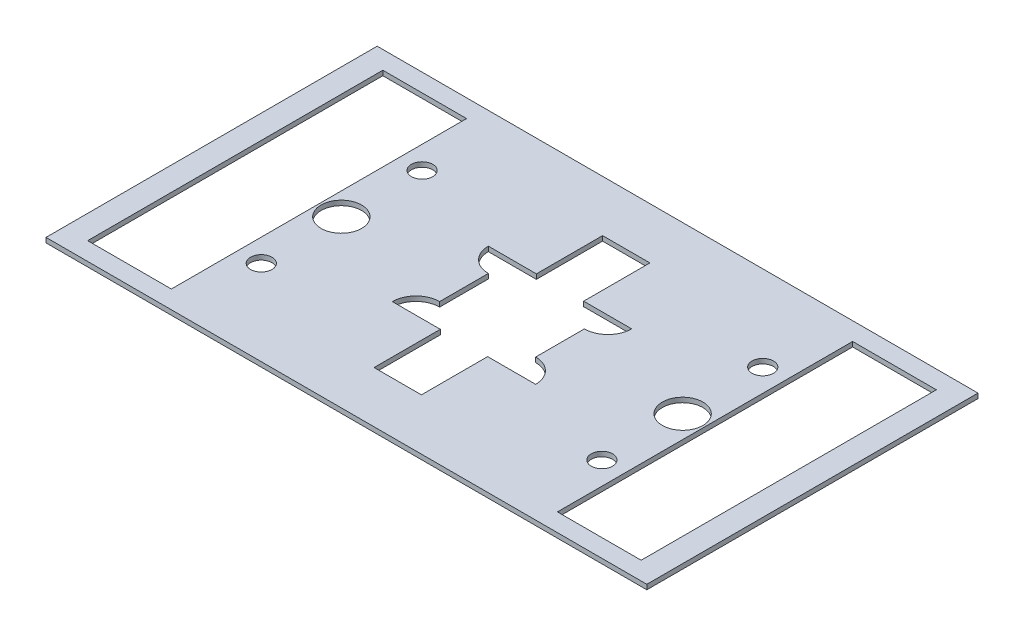
ISO-10303-21;
HEADER;
FILE_DESCRIPTION(('STEP AP214'),'2;1');
FILE_NAME('part.step','',(''),(''),'','','');
FILE_SCHEMA(('AUTOMOTIVE_DESIGN { 1 0 10303 214 1 1 1 1 }'));
ENDSEC;
DATA;
#1=APPLICATION_CONTEXT('core data for automotive mechanical design processes');
#2=APPLICATION_PROTOCOL_DEFINITION('international standard','automotive_design',2000,#1);
#3=PRODUCT_CONTEXT('',#1,'mechanical');
#4=PRODUCT('Part','Part','',(#3));
#5=PRODUCT_RELATED_PRODUCT_CATEGORY('part','',(#4));
#6=PRODUCT_DEFINITION_FORMATION('','',#4);
#7=PRODUCT_DEFINITION_CONTEXT('part definition',#1,'design');
#8=PRODUCT_DEFINITION('design','',#6,#7);
#9=PRODUCT_DEFINITION_SHAPE('','',#8);
#10=(LENGTH_UNIT() NAMED_UNIT(*) SI_UNIT(.MILLI.,.METRE.));
#11=(NAMED_UNIT(*) PLANE_ANGLE_UNIT() SI_UNIT($,.RADIAN.));
#12=(NAMED_UNIT(*) SI_UNIT($,.STERADIAN.) SOLID_ANGLE_UNIT());
#13=UNCERTAINTY_MEASURE_WITH_UNIT(LENGTH_MEASURE(1.E-05),#10,'distance_accuracy_value','');
#14=(GEOMETRIC_REPRESENTATION_CONTEXT(3) GLOBAL_UNCERTAINTY_ASSIGNED_CONTEXT((#13)) GLOBAL_UNIT_ASSIGNED_CONTEXT((#10,
#11,#12)) REPRESENTATION_CONTEXT('',''));
#15=CARTESIAN_POINT('',(0.,0.,0.));
#16=DIRECTION('',(0.,0.,1.));
#17=DIRECTION('',(1.,0.,0.));
#18=AXIS2_PLACEMENT_3D('',#15,#16,#17);
#19=CARTESIAN_POINT('',(0.,0.508,-15.6));
#20=DIRECTION('',(0.,0.,-1.));
#21=DIRECTION('',(-1.,0.,0.));
#22=AXIS2_PLACEMENT_3D('',#19,#20,#21);
#23=PLANE('',#22);
#24=DIRECTION('',(1.,0.,0.));
#25=VECTOR('',#24,1.);
#26=CARTESIAN_POINT('',(0.,0.,-15.6));
#27=LINE('',#26,#25);
#28=CARTESIAN_POINT('',(20.4,0.,-15.6));
#29=VERTEX_POINT('',#28);
#30=CARTESIAN_POINT('',(29.25,0.,-15.6));
#31=VERTEX_POINT('',#30);
#32=EDGE_CURVE('E339',#29,#31,#27,.T.);
#33=ORIENTED_EDGE('',*,*,#32,.T.);
#34=DIRECTION('',(0.,-1.,0.));
#35=VECTOR('',#34,1.);
#36=CARTESIAN_POINT('',(29.25,0.508,-15.6));
#37=LINE('',#36,#35);
#38=CARTESIAN_POINT('',(29.25,0.508,-15.6));
#39=VERTEX_POINT('',#38);
#40=EDGE_CURVE('E11',#39,#31,#37,.T.);
#41=ORIENTED_EDGE('',*,*,#40,.F.);
#42=DIRECTION('',(1.,0.,0.));
#43=VECTOR('',#42,1.);
#44=CARTESIAN_POINT('',(0.,0.508,-15.6));
#45=LINE('',#44,#43);
#46=CARTESIAN_POINT('',(20.4,0.508,-15.6));
#47=VERTEX_POINT('',#46);
#48=EDGE_CURVE('E236',#47,#39,#45,.T.);
#49=ORIENTED_EDGE('',*,*,#48,.F.);
#50=DIRECTION('',(0.,-1.,0.));
#51=VECTOR('',#50,1.);
#52=CARTESIAN_POINT('',(20.4,0.508,-15.6));
#53=LINE('',#52,#51);
#54=EDGE_CURVE('E56',#47,#29,#53,.T.);
#55=ORIENTED_EDGE('',*,*,#54,.T.);
#56=EDGE_LOOP('',(#33,#41,#49,#55));
#57=FACE_BOUND('',#56,.T.);
#58=ADVANCED_FACE('F37',(#57),#23,.F.);
#59=CARTESIAN_POINT('',(29.25,0.508,0.));
#60=DIRECTION('',(1.,0.,0.));
#61=DIRECTION('',(0.,0.,-1.));
#62=AXIS2_PLACEMENT_3D('',#59,#60,#61);
#63=PLANE('',#62);
#64=DIRECTION('',(0.,0.,1.));
#65=VECTOR('',#64,1.);
#66=CARTESIAN_POINT('',(29.25,0.,0.));
#67=LINE('',#66,#65);
#68=CARTESIAN_POINT('',(29.25,0.,15.6));
#69=VERTEX_POINT('',#68);
#70=EDGE_CURVE('E242',#31,#69,#67,.T.);
#71=ORIENTED_EDGE('',*,*,#70,.T.);
#72=DIRECTION('',(0.,-1.,0.));
#73=VECTOR('',#72,1.);
#74=CARTESIAN_POINT('',(29.25,0.508,15.6));
#75=LINE('',#74,#73);
#76=CARTESIAN_POINT('',(29.25,0.508,15.6));
#77=VERTEX_POINT('',#76);
#78=EDGE_CURVE('E47',#77,#69,#75,.T.);
#79=ORIENTED_EDGE('',*,*,#78,.F.);
#80=DIRECTION('',(0.,0.,1.));
#81=VECTOR('',#80,1.);
#82=CARTESIAN_POINT('',(29.25,0.508,0.));
#83=LINE('',#82,#81);
#84=EDGE_CURVE('E230',#39,#77,#83,.T.);
#85=ORIENTED_EDGE('',*,*,#84,.F.);
#86=ORIENTED_EDGE('',*,*,#40,.T.);
#87=EDGE_LOOP('',(#71,#79,#85,#86));
#88=FACE_BOUND('',#87,.T.);
#89=ADVANCED_FACE('F241',(#88),#63,.F.);
#90=CARTESIAN_POINT('',(0.,0.508,15.6));
#91=DIRECTION('',(0.,0.,-1.));
#92=DIRECTION('',(-1.,0.,0.));
#93=AXIS2_PLACEMENT_3D('',#90,#91,#92);
#94=PLANE('',#93);
#95=DIRECTION('',(1.,0.,0.));
#96=VECTOR('',#95,1.);
#97=CARTESIAN_POINT('',(0.,0.,15.6));
#98=LINE('',#97,#96);
#99=CARTESIAN_POINT('',(20.4,0.,15.6));
#100=VERTEX_POINT('',#99);
#101=EDGE_CURVE('E342',#100,#69,#98,.T.);
#102=ORIENTED_EDGE('',*,*,#101,.F.);
#103=DIRECTION('',(0.,-1.,0.));
#104=VECTOR('',#103,1.);
#105=CARTESIAN_POINT('',(20.4,0.508,15.6));
#106=LINE('',#105,#104);
#107=CARTESIAN_POINT('',(20.4,0.508,15.6));
#108=VERTEX_POINT('',#107);
#109=EDGE_CURVE('E142',#108,#100,#106,.T.);
#110=ORIENTED_EDGE('',*,*,#109,.F.);
#111=DIRECTION('',(1.,0.,0.));
#112=VECTOR('',#111,1.);
#113=CARTESIAN_POINT('',(0.,0.508,15.6));
#114=LINE('',#113,#112);
#115=EDGE_CURVE('E235',#108,#77,#114,.T.);
#116=ORIENTED_EDGE('',*,*,#115,.T.);
#117=ORIENTED_EDGE('',*,*,#78,.T.);
#118=EDGE_LOOP('',(#102,#110,#116,#117));
#119=FACE_BOUND('',#118,.T.);
#120=ADVANCED_FACE('F246',(#119),#94,.T.);
#121=CARTESIAN_POINT('',(0.,0.508,-15.6));
#122=DIRECTION('',(0.,0.,-1.));
#123=DIRECTION('',(-1.,0.,0.));
#124=AXIS2_PLACEMENT_3D('',#121,#122,#123);
#125=PLANE('',#124);
#126=DIRECTION('',(1.,0.,0.));
#127=VECTOR('',#126,1.);
#128=CARTESIAN_POINT('',(0.,0.,-15.6));
#129=LINE('',#128,#127);
#130=CARTESIAN_POINT('',(-29.25,0.,-15.6));
#131=VERTEX_POINT('',#130);
#132=CARTESIAN_POINT('',(-20.4,0.,-15.6));
#133=VERTEX_POINT('',#132);
#134=EDGE_CURVE('E327',#131,#133,#129,.T.);
#135=ORIENTED_EDGE('',*,*,#134,.T.);
#136=DIRECTION('',(0.,-1.,0.));
#137=VECTOR('',#136,1.);
#138=CARTESIAN_POINT('',(-20.4,0.508,-15.6));
#139=LINE('',#138,#137);
#140=CARTESIAN_POINT('',(-20.4,0.508,-15.6));
#141=VERTEX_POINT('',#140);
#142=EDGE_CURVE('E349',#141,#133,#139,.T.);
#143=ORIENTED_EDGE('',*,*,#142,.F.);
#144=DIRECTION('',(1.,0.,0.));
#145=VECTOR('',#144,1.);
#146=CARTESIAN_POINT('',(0.,0.508,-15.6));
#147=LINE('',#146,#145);
#148=CARTESIAN_POINT('',(-29.25,0.508,-15.6));
#149=VERTEX_POINT('',#148);
#150=EDGE_CURVE('E488',#149,#141,#147,.T.);
#151=ORIENTED_EDGE('',*,*,#150,.F.);
#152=DIRECTION('',(0.,-1.,0.));
#153=VECTOR('',#152,1.);
#154=CARTESIAN_POINT('',(-29.25,0.508,-15.6));
#155=LINE('',#154,#153);
#156=EDGE_CURVE('E351',#149,#131,#155,.T.);
#157=ORIENTED_EDGE('',*,*,#156,.T.);
#158=EDGE_LOOP('',(#135,#143,#151,#157));
#159=FACE_BOUND('',#158,.T.);
#160=ADVANCED_FACE('F514',(#159),#125,.F.);
#161=CARTESIAN_POINT('',(-20.4,0.508,0.));
#162=DIRECTION('',(1.,0.,0.));
#163=DIRECTION('',(0.,0.,-1.));
#164=AXIS2_PLACEMENT_3D('',#161,#162,#163);
#165=PLANE('',#164);
#166=DIRECTION('',(0.,0.,1.));
#167=VECTOR('',#166,1.);
#168=CARTESIAN_POINT('',(-20.4,0.,0.));
#169=LINE('',#168,#167);
#170=CARTESIAN_POINT('',(-20.4,0.,15.6));
#171=VERTEX_POINT('',#170);
#172=EDGE_CURVE('E330',#133,#171,#169,.T.);
#173=ORIENTED_EDGE('',*,*,#172,.T.);
#174=DIRECTION('',(0.,-1.,0.));
#175=VECTOR('',#174,1.);
#176=CARTESIAN_POINT('',(-20.4,0.508,15.6));
#177=LINE('',#176,#175);
#178=CARTESIAN_POINT('',(-20.4,0.508,15.6));
#179=VERTEX_POINT('',#178);
#180=EDGE_CURVE('E356',#179,#171,#177,.T.);
#181=ORIENTED_EDGE('',*,*,#180,.F.);
#182=DIRECTION('',(0.,0.,1.));
#183=VECTOR('',#182,1.);
#184=CARTESIAN_POINT('',(-20.4,0.508,0.));
#185=LINE('',#184,#183);
#186=EDGE_CURVE('E491',#141,#179,#185,.T.);
#187=ORIENTED_EDGE('',*,*,#186,.F.);
#188=ORIENTED_EDGE('',*,*,#142,.T.);
#189=EDGE_LOOP('',(#173,#181,#187,#188));
#190=FACE_BOUND('',#189,.T.);
#191=ADVANCED_FACE('F516',(#190),#165,.F.);
#192=CARTESIAN_POINT('',(0.,0.508,15.6));
#193=DIRECTION('',(0.,0.,-1.));
#194=DIRECTION('',(-1.,0.,0.));
#195=AXIS2_PLACEMENT_3D('',#192,#193,#194);
#196=PLANE('',#195);
#197=DIRECTION('',(1.,0.,0.));
#198=VECTOR('',#197,1.);
#199=CARTESIAN_POINT('',(0.,0.,15.6));
#200=LINE('',#199,#198);
#201=CARTESIAN_POINT('',(-29.25,0.,15.6));
#202=VERTEX_POINT('',#201);
#203=EDGE_CURVE('E333',#202,#171,#200,.T.);
#204=ORIENTED_EDGE('',*,*,#203,.F.);
#205=DIRECTION('',(0.,-1.,0.));
#206=VECTOR('',#205,1.);
#207=CARTESIAN_POINT('',(-29.25,0.508,15.6));
#208=LINE('',#207,#206);
#209=CARTESIAN_POINT('',(-29.25,0.508,15.6));
#210=VERTEX_POINT('',#209);
#211=EDGE_CURVE('E353',#210,#202,#208,.T.);
#212=ORIENTED_EDGE('',*,*,#211,.F.);
#213=DIRECTION('',(1.,0.,0.));
#214=VECTOR('',#213,1.);
#215=CARTESIAN_POINT('',(0.,0.508,15.6));
#216=LINE('',#215,#214);
#217=EDGE_CURVE('E493',#210,#179,#216,.T.);
#218=ORIENTED_EDGE('',*,*,#217,.T.);
#219=ORIENTED_EDGE('',*,*,#180,.T.);
#220=EDGE_LOOP('',(#204,#212,#218,#219));
#221=FACE_BOUND('',#220,.T.);
#222=ADVANCED_FACE('F509',(#221),#196,.T.);
#223=CARTESIAN_POINT('',(31.75,0.508,0.));
#224=DIRECTION('',(1.,0.,0.));
#225=DIRECTION('',(0.,0.,-1.));
#226=AXIS2_PLACEMENT_3D('',#223,#224,#225);
#227=PLANE('',#226);
#228=DIRECTION('',(0.,0.,1.));
#229=VECTOR('',#228,1.);
#230=CARTESIAN_POINT('',(31.75,0.,0.));
#231=LINE('',#230,#229);
#232=CARTESIAN_POINT('',(31.75,0.,-17.5));
#233=VERTEX_POINT('',#232);
#234=CARTESIAN_POINT('',(31.75,0.,17.5));
#235=VERTEX_POINT('',#234);
#236=EDGE_CURVE('E315',#233,#235,#231,.T.);
#237=ORIENTED_EDGE('',*,*,#236,.F.);
#238=DIRECTION('',(0.,-1.,0.));
#239=VECTOR('',#238,1.);
#240=CARTESIAN_POINT('',(31.75,0.508,-17.5));
#241=LINE('',#240,#239);
#242=CARTESIAN_POINT('',(31.75,0.508,-17.5));
#243=VERTEX_POINT('',#242);
#244=EDGE_CURVE('E354',#243,#233,#241,.T.);
#245=ORIENTED_EDGE('',*,*,#244,.F.);
#246=DIRECTION('',(0.,0.,1.));
#247=VECTOR('',#246,1.);
#248=CARTESIAN_POINT('',(31.75,0.508,0.));
#249=LINE('',#248,#247);
#250=CARTESIAN_POINT('',(31.75,0.508,17.5));
#251=VERTEX_POINT('',#250);
#252=EDGE_CURVE('E477',#243,#251,#249,.T.);
#253=ORIENTED_EDGE('',*,*,#252,.T.);
#254=DIRECTION('',(0.,-1.,0.));
#255=VECTOR('',#254,1.);
#256=CARTESIAN_POINT('',(31.75,0.508,17.5));
#257=LINE('',#256,#255);
#258=EDGE_CURVE('E360',#251,#235,#257,.T.);
#259=ORIENTED_EDGE('',*,*,#258,.T.);
#260=EDGE_LOOP('',(#237,#245,#253,#259));
#261=FACE_BOUND('',#260,.T.);
#262=ADVANCED_FACE('F523',(#261),#227,.T.);
#263=CARTESIAN_POINT('',(0.,0.508,-17.5));
#264=DIRECTION('',(0.,0.,-1.));
#265=DIRECTION('',(-1.,0.,0.));
#266=AXIS2_PLACEMENT_3D('',#263,#264,#265);
#267=PLANE('',#266);
#268=DIRECTION('',(1.,0.,0.));
#269=VECTOR('',#268,1.);
#270=CARTESIAN_POINT('',(0.,0.,-17.5));
#271=LINE('',#270,#269);
#272=CARTESIAN_POINT('',(-31.75,0.,-17.5));
#273=VERTEX_POINT('',#272);
#274=EDGE_CURVE('E318',#273,#233,#271,.T.);
#275=ORIENTED_EDGE('',*,*,#274,.F.);
#276=DIRECTION('',(0.,-1.,0.));
#277=VECTOR('',#276,1.);
#278=CARTESIAN_POINT('',(-31.75,0.508,-17.5));
#279=LINE('',#278,#277);
#280=CARTESIAN_POINT('',(-31.75,0.508,-17.5));
#281=VERTEX_POINT('',#280);
#282=EDGE_CURVE('E365',#281,#273,#279,.T.);
#283=ORIENTED_EDGE('',*,*,#282,.F.);
#284=DIRECTION('',(1.,0.,0.));
#285=VECTOR('',#284,1.);
#286=CARTESIAN_POINT('',(0.,0.508,-17.5));
#287=LINE('',#286,#285);
#288=EDGE_CURVE('E480',#281,#243,#287,.T.);
#289=ORIENTED_EDGE('',*,*,#288,.T.);
#290=ORIENTED_EDGE('',*,*,#244,.T.);
#291=EDGE_LOOP('',(#275,#283,#289,#290));
#292=FACE_BOUND('',#291,.T.);
#293=ADVANCED_FACE('F604',(#292),#267,.T.);
#294=CARTESIAN_POINT('',(-31.75,0.508,0.));
#295=DIRECTION('',(1.,0.,0.));
#296=DIRECTION('',(0.,0.,-1.));
#297=AXIS2_PLACEMENT_3D('',#294,#295,#296);
#298=PLANE('',#297);
#299=DIRECTION('',(0.,0.,1.));
#300=VECTOR('',#299,1.);
#301=CARTESIAN_POINT('',(-31.75,0.,0.));
#302=LINE('',#301,#300);
#303=CARTESIAN_POINT('',(-31.75,0.,17.5));
#304=VERTEX_POINT('',#303);
#305=EDGE_CURVE('E321',#273,#304,#302,.T.);
#306=ORIENTED_EDGE('',*,*,#305,.T.);
#307=DIRECTION('',(0.,-1.,0.));
#308=VECTOR('',#307,1.);
#309=CARTESIAN_POINT('',(-31.75,0.508,17.5));
#310=LINE('',#309,#308);
#311=CARTESIAN_POINT('',(-31.75,0.508,17.5));
#312=VERTEX_POINT('',#311);
#313=EDGE_CURVE('E362',#312,#304,#310,.T.);
#314=ORIENTED_EDGE('',*,*,#313,.F.);
#315=DIRECTION('',(0.,0.,1.));
#316=VECTOR('',#315,1.);
#317=CARTESIAN_POINT('',(-31.75,0.508,0.));
#318=LINE('',#317,#316);
#319=EDGE_CURVE('E483',#281,#312,#318,.T.);
#320=ORIENTED_EDGE('',*,*,#319,.F.);
#321=ORIENTED_EDGE('',*,*,#282,.T.);
#322=EDGE_LOOP('',(#306,#314,#320,#321));
#323=FACE_BOUND('',#322,.T.);
#324=ADVANCED_FACE('F600',(#323),#298,.F.);
#325=CARTESIAN_POINT('',(0.,0.508,5.075));
#326=DIRECTION('',(0.,0.,-1.));
#327=DIRECTION('',(-1.,0.,0.));
#328=AXIS2_PLACEMENT_3D('',#325,#326,#327);
#329=PLANE('',#328);
#330=DIRECTION('',(1.,0.,0.));
#331=VECTOR('',#330,1.);
#332=CARTESIAN_POINT('',(0.,0.,5.075));
#333=LINE('',#332,#331);
#334=CARTESIAN_POINT('',(-7.575,0.,5.075));
#335=VERTEX_POINT('',#334);
#336=CARTESIAN_POINT('',(-2.5,0.,5.075));
#337=VERTEX_POINT('',#336);
#338=EDGE_CURVE('E253',#335,#337,#333,.T.);
#339=ORIENTED_EDGE('',*,*,#338,.F.);
#340=DIRECTION('',(0.,-1.,0.));
#341=VECTOR('',#340,1.);
#342=CARTESIAN_POINT('',(-7.575,0.508,5.075));
#343=LINE('',#342,#341);
#344=CARTESIAN_POINT('',(-7.575,0.508,5.075));
#345=VERTEX_POINT('',#344);
#346=EDGE_CURVE('E41',#345,#335,#343,.T.);
#347=ORIENTED_EDGE('',*,*,#346,.F.);
#348=DIRECTION('',(1.,0.,0.));
#349=VECTOR('',#348,1.);
#350=CARTESIAN_POINT('',(0.,0.508,5.075));
#351=LINE('',#350,#349);
#352=CARTESIAN_POINT('',(-2.5,0.508,5.075));
#353=VERTEX_POINT('',#352);
#354=EDGE_CURVE('E347',#345,#353,#351,.T.);
#355=ORIENTED_EDGE('',*,*,#354,.T.);
#356=DIRECTION('',(0.,-1.,0.));
#357=VECTOR('',#356,1.);
#358=CARTESIAN_POINT('',(-2.5,0.508,5.075));
#359=LINE('',#358,#357);
#360=EDGE_CURVE('E249',#353,#337,#359,.T.);
#361=ORIENTED_EDGE('',*,*,#360,.T.);
#362=EDGE_LOOP('',(#339,#347,#355,#361));
#363=FACE_BOUND('',#362,.T.);
#364=ADVANCED_FACE('F39',(#363),#329,.T.);
#365=CARTESIAN_POINT('',(-5.075,0.508,5.075));
#366=DIRECTION('',(0.,-1.,0.));
#367=DIRECTION('',(0.,0.,-1.));
#368=AXIS2_PLACEMENT_3D('',#365,#366,#367);
#369=CYLINDRICAL_SURFACE('',#368,2.5);
#370=CARTESIAN_POINT('',(-5.075,0.,5.075));
#371=DIRECTION('',(0.,1.,0.));
#372=DIRECTION('',(0.,0.,1.));
#373=AXIS2_PLACEMENT_3D('',#370,#371,#372);
#374=CIRCLE('',#373,2.5);
#375=CARTESIAN_POINT('',(-5.075,0.,2.575));
#376=VERTEX_POINT('',#375);
#377=EDGE_CURVE('E256',#376,#335,#374,.T.);
#378=ORIENTED_EDGE('',*,*,#377,.F.);
#379=DIRECTION('',(0.,-1.,0.));
#380=VECTOR('',#379,1.);
#381=CARTESIAN_POINT('',(-5.075,0.508,2.575));
#382=LINE('',#381,#380);
#383=CARTESIAN_POINT('',(-5.075,0.508,2.575));
#384=VERTEX_POINT('',#383);
#385=EDGE_CURVE('E398',#384,#376,#382,.T.);
#386=ORIENTED_EDGE('',*,*,#385,.F.);
#387=CARTESIAN_POINT('',(-5.075,0.508,5.075));
#388=DIRECTION('',(0.,1.,0.));
#389=DIRECTION('',(0.,0.,1.));
#390=AXIS2_PLACEMENT_3D('',#387,#388,#389);
#391=CIRCLE('',#390,2.5);
#392=EDGE_CURVE('E407',#384,#345,#391,.T.);
#393=ORIENTED_EDGE('',*,*,#392,.T.);
#394=ORIENTED_EDGE('',*,*,#346,.T.);
#395=EDGE_LOOP('',(#378,#386,#393,#394));
#396=FACE_BOUND('',#395,.T.);
#397=ADVANCED_FACE('F405',(#396),#369,.F.);
#398=CARTESIAN_POINT('',(-5.075,0.508,0.));
#399=DIRECTION('',(1.,0.,0.));
#400=DIRECTION('',(0.,0.,-1.));
#401=AXIS2_PLACEMENT_3D('',#398,#399,#400);
#402=PLANE('',#401);
#403=DIRECTION('',(0.,0.,1.));
#404=VECTOR('',#403,1.);
#405=CARTESIAN_POINT('',(-5.075,0.,0.));
#406=LINE('',#405,#404);
#407=CARTESIAN_POINT('',(-5.075,0.,-2.575));
#408=VERTEX_POINT('',#407);
#409=EDGE_CURVE('E259',#408,#376,#406,.T.);
#410=ORIENTED_EDGE('',*,*,#409,.F.);
#411=DIRECTION('',(0.,-1.,0.));
#412=VECTOR('',#411,1.);
#413=CARTESIAN_POINT('',(-5.075,0.508,-2.575));
#414=LINE('',#413,#412);
#415=CARTESIAN_POINT('',(-5.075,0.508,-2.575));
#416=VERTEX_POINT('',#415);
#417=EDGE_CURVE('E397',#416,#408,#414,.T.);
#418=ORIENTED_EDGE('',*,*,#417,.F.);
#419=DIRECTION('',(0.,0.,1.));
#420=VECTOR('',#419,1.);
#421=CARTESIAN_POINT('',(-5.075,0.508,0.));
#422=LINE('',#421,#420);
#423=EDGE_CURVE('E416',#416,#384,#422,.T.);
#424=ORIENTED_EDGE('',*,*,#423,.T.);
#425=ORIENTED_EDGE('',*,*,#385,.T.);
#426=EDGE_LOOP('',(#410,#418,#424,#425));
#427=FACE_BOUND('',#426,.T.);
#428=ADVANCED_FACE('F414',(#427),#402,.T.);
#429=CARTESIAN_POINT('',(-5.075,0.508,-5.075));
#430=DIRECTION('',(0.,-1.,0.));
#431=DIRECTION('',(0.,0.,-1.));
#432=AXIS2_PLACEMENT_3D('',#429,#430,#431);
#433=CYLINDRICAL_SURFACE('',#432,2.5);
#434=CARTESIAN_POINT('',(-5.075,0.,-5.075));
#435=DIRECTION('',(0.,1.,0.));
#436=DIRECTION('',(0.,0.,1.));
#437=AXIS2_PLACEMENT_3D('',#434,#435,#436);
#438=CIRCLE('',#437,2.5);
#439=CARTESIAN_POINT('',(-7.575,0.,-5.075));
#440=VERTEX_POINT('',#439);
#441=EDGE_CURVE('E262',#440,#408,#438,.T.);
#442=ORIENTED_EDGE('',*,*,#441,.F.);
#443=DIRECTION('',(0.,-1.,0.));
#444=VECTOR('',#443,1.);
#445=CARTESIAN_POINT('',(-7.575,0.508,-5.075));
#446=LINE('',#445,#444);
#447=CARTESIAN_POINT('',(-7.575,0.508,-5.075));
#448=VERTEX_POINT('',#447);
#449=EDGE_CURVE('E395',#448,#440,#446,.T.);
#450=ORIENTED_EDGE('',*,*,#449,.F.);
#451=CARTESIAN_POINT('',(-5.075,0.508,-5.075));
#452=DIRECTION('',(0.,1.,0.));
#453=DIRECTION('',(0.,0.,1.));
#454=AXIS2_PLACEMENT_3D('',#451,#452,#453);
#455=CIRCLE('',#454,2.5);
#456=EDGE_CURVE('E422',#448,#416,#455,.T.);
#457=ORIENTED_EDGE('',*,*,#456,.T.);
#458=ORIENTED_EDGE('',*,*,#417,.T.);
#459=EDGE_LOOP('',(#442,#450,#457,#458));
#460=FACE_BOUND('',#459,.T.);
#461=ADVANCED_FACE('F424',(#460),#433,.F.);
#462=CARTESIAN_POINT('',(0.,0.508,-5.075));
#463=DIRECTION('',(0.,0.,-1.));
#464=DIRECTION('',(-1.,0.,0.));
#465=AXIS2_PLACEMENT_3D('',#462,#463,#464);
#466=PLANE('',#465);
#467=DIRECTION('',(1.,0.,0.));
#468=VECTOR('',#467,1.);
#469=CARTESIAN_POINT('',(0.,0.,-5.075));
#470=LINE('',#469,#468);
#471=CARTESIAN_POINT('',(-2.5,0.,-5.075));
#472=VERTEX_POINT('',#471);
#473=EDGE_CURVE('E265',#440,#472,#470,.T.);
#474=ORIENTED_EDGE('',*,*,#473,.T.);
#475=DIRECTION('',(0.,-1.,0.));
#476=VECTOR('',#475,1.);
#477=CARTESIAN_POINT('',(-2.5,0.508,-5.075));
#478=LINE('',#477,#476);
#479=CARTESIAN_POINT('',(-2.5,0.508,-5.075));
#480=VERTEX_POINT('',#479);
#481=EDGE_CURVE('E392',#480,#472,#478,.T.);
#482=ORIENTED_EDGE('',*,*,#481,.F.);
#483=DIRECTION('',(1.,0.,0.));
#484=VECTOR('',#483,1.);
#485=CARTESIAN_POINT('',(0.,0.508,-5.075));
#486=LINE('',#485,#484);
#487=EDGE_CURVE('E426',#448,#480,#486,.T.);
#488=ORIENTED_EDGE('',*,*,#487,.F.);
#489=ORIENTED_EDGE('',*,*,#449,.T.);
#490=EDGE_LOOP('',(#474,#482,#488,#489));
#491=FACE_BOUND('',#490,.T.);
#492=ADVANCED_FACE('F588',(#491),#466,.F.);
#493=CARTESIAN_POINT('',(-2.5,0.508,0.));
#494=DIRECTION('',(-1.,0.,0.));
#495=DIRECTION('',(0.,0.,1.));
#496=AXIS2_PLACEMENT_3D('',#493,#494,#495);
#497=PLANE('',#496);
#498=DIRECTION('',(0.,0.,-1.));
#499=VECTOR('',#498,1.);
#500=CARTESIAN_POINT('',(-2.5,0.,0.));
#501=LINE('',#500,#499);
#502=CARTESIAN_POINT('',(-2.5,0.,-12.075));
#503=VERTEX_POINT('',#502);
#504=EDGE_CURVE('E267',#472,#503,#501,.T.);
#505=ORIENTED_EDGE('',*,*,#504,.T.);
#506=DIRECTION('',(0.,-1.,0.));
#507=VECTOR('',#506,1.);
#508=CARTESIAN_POINT('',(-2.5,0.508,-12.075));
#509=LINE('',#508,#507);
#510=CARTESIAN_POINT('',(-2.5,0.508,-12.075));
#511=VERTEX_POINT('',#510);
#512=EDGE_CURVE('E389',#511,#503,#509,.T.);
#513=ORIENTED_EDGE('',*,*,#512,.F.);
#514=DIRECTION('',(0.,0.,-1.));
#515=VECTOR('',#514,1.);
#516=CARTESIAN_POINT('',(-2.5,0.508,0.));
#517=LINE('',#516,#515);
#518=EDGE_CURVE('E428',#480,#511,#517,.T.);
#519=ORIENTED_EDGE('',*,*,#518,.F.);
#520=ORIENTED_EDGE('',*,*,#481,.T.);
#521=EDGE_LOOP('',(#505,#513,#519,#520));
#522=FACE_BOUND('',#521,.T.);
#523=ADVANCED_FACE('F584',(#522),#497,.F.);
#524=CARTESIAN_POINT('',(0.,0.508,-12.075));
#525=DIRECTION('',(0.,0.,-1.));
#526=DIRECTION('',(-1.,0.,0.));
#527=AXIS2_PLACEMENT_3D('',#524,#525,#526);
#528=PLANE('',#527);
#529=DIRECTION('',(1.,0.,0.));
#530=VECTOR('',#529,1.);
#531=CARTESIAN_POINT('',(0.,0.,-12.075));
#532=LINE('',#531,#530);
#533=CARTESIAN_POINT('',(2.5,0.,-12.075));
#534=VERTEX_POINT('',#533);
#535=EDGE_CURVE('E269',#503,#534,#532,.T.);
#536=ORIENTED_EDGE('',*,*,#535,.T.);
#537=DIRECTION('',(0.,-1.,0.));
#538=VECTOR('',#537,1.);
#539=CARTESIAN_POINT('',(2.5,0.508,-12.075));
#540=LINE('',#539,#538);
#541=CARTESIAN_POINT('',(2.5,0.508,-12.075));
#542=VERTEX_POINT('',#541);
#543=EDGE_CURVE('E386',#542,#534,#540,.T.);
#544=ORIENTED_EDGE('',*,*,#543,.F.);
#545=DIRECTION('',(1.,0.,0.));
#546=VECTOR('',#545,1.);
#547=CARTESIAN_POINT('',(0.,0.508,-12.075));
#548=LINE('',#547,#546);
#549=EDGE_CURVE('E433',#511,#542,#548,.T.);
#550=ORIENTED_EDGE('',*,*,#549,.F.);
#551=ORIENTED_EDGE('',*,*,#512,.T.);
#552=EDGE_LOOP('',(#536,#544,#550,#551));
#553=FACE_BOUND('',#552,.T.);
#554=ADVANCED_FACE('F580',(#553),#528,.F.);
#555=CARTESIAN_POINT('',(2.5,0.508,0.));
#556=DIRECTION('',(1.,0.,0.));
#557=DIRECTION('',(0.,0.,-1.));
#558=AXIS2_PLACEMENT_3D('',#555,#556,#557);
#559=PLANE('',#558);
#560=DIRECTION('',(0.,0.,1.));
#561=VECTOR('',#560,1.);
#562=CARTESIAN_POINT('',(2.5,0.,0.));
#563=LINE('',#562,#561);
#564=CARTESIAN_POINT('',(2.5,0.,-5.075));
#565=VERTEX_POINT('',#564);
#566=EDGE_CURVE('E271',#534,#565,#563,.T.);
#567=ORIENTED_EDGE('',*,*,#566,.T.);
#568=DIRECTION('',(0.,-1.,0.));
#569=VECTOR('',#568,1.);
#570=CARTESIAN_POINT('',(2.5,0.508,-5.075));
#571=LINE('',#570,#569);
#572=CARTESIAN_POINT('',(2.5,0.508,-5.075));
#573=VERTEX_POINT('',#572);
#574=EDGE_CURVE('E383',#573,#565,#571,.T.);
#575=ORIENTED_EDGE('',*,*,#574,.F.);
#576=DIRECTION('',(0.,0.,1.));
#577=VECTOR('',#576,1.);
#578=CARTESIAN_POINT('',(2.5,0.508,0.));
#579=LINE('',#578,#577);
#580=EDGE_CURVE('E435',#542,#573,#579,.T.);
#581=ORIENTED_EDGE('',*,*,#580,.F.);
#582=ORIENTED_EDGE('',*,*,#543,.T.);
#583=EDGE_LOOP('',(#567,#575,#581,#582));
#584=FACE_BOUND('',#583,.T.);
#585=ADVANCED_FACE('F576',(#584),#559,.F.);
#586=CARTESIAN_POINT('',(0.,0.508,-5.075));
#587=DIRECTION('',(0.,0.,-1.));
#588=DIRECTION('',(-1.,0.,0.));
#589=AXIS2_PLACEMENT_3D('',#586,#587,#588);
#590=PLANE('',#589);
#591=DIRECTION('',(1.,0.,0.));
#592=VECTOR('',#591,1.);
#593=CARTESIAN_POINT('',(0.,0.,-5.075));
#594=LINE('',#593,#592);
#595=CARTESIAN_POINT('',(7.575,0.,-5.075));
#596=VERTEX_POINT('',#595);
#597=EDGE_CURVE('E273',#565,#596,#594,.T.);
#598=ORIENTED_EDGE('',*,*,#597,.T.);
#599=DIRECTION('',(0.,-1.,0.));
#600=VECTOR('',#599,1.);
#601=CARTESIAN_POINT('',(7.575,0.508,-5.075));
#602=LINE('',#601,#600);
#603=CARTESIAN_POINT('',(7.575,0.508,-5.075));
#604=VERTEX_POINT('',#603);
#605=EDGE_CURVE('E381',#604,#596,#602,.T.);
#606=ORIENTED_EDGE('',*,*,#605,.F.);
#607=DIRECTION('',(1.,0.,0.));
#608=VECTOR('',#607,1.);
#609=CARTESIAN_POINT('',(0.,0.508,-5.075));
#610=LINE('',#609,#608);
#611=EDGE_CURVE('E437',#573,#604,#610,.T.);
#612=ORIENTED_EDGE('',*,*,#611,.F.);
#613=ORIENTED_EDGE('',*,*,#574,.T.);
#614=EDGE_LOOP('',(#598,#606,#612,#613));
#615=FACE_BOUND('',#614,.T.);
#616=ADVANCED_FACE('F572',(#615),#590,.F.);
#617=CARTESIAN_POINT('',(5.075,0.508,-5.075));
#618=DIRECTION('',(0.,-1.,0.));
#619=DIRECTION('',(0.,0.,-1.));
#620=AXIS2_PLACEMENT_3D('',#617,#618,#619);
#621=CYLINDRICAL_SURFACE('',#620,2.5);
#622=CARTESIAN_POINT('',(5.075,0.,-5.075));
#623=DIRECTION('',(0.,1.,0.));
#624=DIRECTION('',(0.,0.,1.));
#625=AXIS2_PLACEMENT_3D('',#622,#623,#624);
#626=CIRCLE('',#625,2.5);
#627=CARTESIAN_POINT('',(5.075,0.,-2.575));
#628=VERTEX_POINT('',#627);
#629=EDGE_CURVE('E276',#628,#596,#626,.T.);
#630=ORIENTED_EDGE('',*,*,#629,.F.);
#631=DIRECTION('',(0.,-1.,0.));
#632=VECTOR('',#631,1.);
#633=CARTESIAN_POINT('',(5.075,0.508,-2.575));
#634=LINE('',#633,#632);
#635=CARTESIAN_POINT('',(5.075,0.508,-2.575));
#636=VERTEX_POINT('',#635);
#637=EDGE_CURVE('E379',#636,#628,#634,.T.);
#638=ORIENTED_EDGE('',*,*,#637,.F.);
#639=CARTESIAN_POINT('',(5.075,0.508,-5.075));
#640=DIRECTION('',(0.,1.,0.));
#641=DIRECTION('',(0.,0.,1.));
#642=AXIS2_PLACEMENT_3D('',#639,#640,#641);
#643=CIRCLE('',#642,2.5);
#644=EDGE_CURVE('E439',#636,#604,#643,.T.);
#645=ORIENTED_EDGE('',*,*,#644,.T.);
#646=ORIENTED_EDGE('',*,*,#605,.T.);
#647=EDGE_LOOP('',(#630,#638,#645,#646));
#648=FACE_BOUND('',#647,.T.);
#649=ADVANCED_FACE('F568',(#648),#621,.F.);
#650=CARTESIAN_POINT('',(5.075,0.508,0.));
#651=DIRECTION('',(1.,0.,0.));
#652=DIRECTION('',(0.,0.,-1.));
#653=AXIS2_PLACEMENT_3D('',#650,#651,#652);
#654=PLANE('',#653);
#655=DIRECTION('',(0.,0.,1.));
#656=VECTOR('',#655,1.);
#657=CARTESIAN_POINT('',(5.075,0.,0.));
#658=LINE('',#657,#656);
#659=CARTESIAN_POINT('',(5.075,0.,2.575));
#660=VERTEX_POINT('',#659);
#661=EDGE_CURVE('E279',#628,#660,#658,.T.);
#662=ORIENTED_EDGE('',*,*,#661,.T.);
#663=DIRECTION('',(0.,-1.,0.));
#664=VECTOR('',#663,1.);
#665=CARTESIAN_POINT('',(5.075,0.508,2.575));
#666=LINE('',#665,#664);
#667=CARTESIAN_POINT('',(5.075,0.508,2.575));
#668=VERTEX_POINT('',#667);
#669=EDGE_CURVE('E377',#668,#660,#666,.T.);
#670=ORIENTED_EDGE('',*,*,#669,.F.);
#671=DIRECTION('',(0.,0.,1.));
#672=VECTOR('',#671,1.);
#673=CARTESIAN_POINT('',(5.075,0.508,0.));
#674=LINE('',#673,#672);
#675=EDGE_CURVE('E442',#636,#668,#674,.T.);
#676=ORIENTED_EDGE('',*,*,#675,.F.);
#677=ORIENTED_EDGE('',*,*,#637,.T.);
#678=EDGE_LOOP('',(#662,#670,#676,#677));
#679=FACE_BOUND('',#678,.T.);
#680=ADVANCED_FACE('F564',(#679),#654,.F.);
#681=CARTESIAN_POINT('',(5.075,0.508,5.075));
#682=DIRECTION('',(0.,-1.,0.));
#683=DIRECTION('',(0.,0.,-1.));
#684=AXIS2_PLACEMENT_3D('',#681,#682,#683);
#685=CYLINDRICAL_SURFACE('',#684,2.5);
#686=CARTESIAN_POINT('',(5.075,0.,5.075));
#687=DIRECTION('',(0.,1.,0.));
#688=DIRECTION('',(0.,0.,1.));
#689=AXIS2_PLACEMENT_3D('',#686,#687,#688);
#690=CIRCLE('',#689,2.5);
#691=CARTESIAN_POINT('',(7.575,0.,5.075));
#692=VERTEX_POINT('',#691);
#693=EDGE_CURVE('E282',#692,#660,#690,.T.);
#694=ORIENTED_EDGE('',*,*,#693,.F.);
#695=DIRECTION('',(0.,-1.,0.));
#696=VECTOR('',#695,1.);
#697=CARTESIAN_POINT('',(7.575,0.508,5.075));
#698=LINE('',#697,#696);
#699=CARTESIAN_POINT('',(7.575,0.508,5.075));
#700=VERTEX_POINT('',#699);
#701=EDGE_CURVE('E375',#700,#692,#698,.T.);
#702=ORIENTED_EDGE('',*,*,#701,.F.);
#703=CARTESIAN_POINT('',(5.075,0.508,5.075));
#704=DIRECTION('',(0.,1.,0.));
#705=DIRECTION('',(0.,0.,1.));
#706=AXIS2_PLACEMENT_3D('',#703,#704,#705);
#707=CIRCLE('',#706,2.5);
#708=EDGE_CURVE('E444',#700,#668,#707,.T.);
#709=ORIENTED_EDGE('',*,*,#708,.T.);
#710=ORIENTED_EDGE('',*,*,#669,.T.);
#711=EDGE_LOOP('',(#694,#702,#709,#710));
#712=FACE_BOUND('',#711,.T.);
#713=ADVANCED_FACE('F560',(#712),#685,.F.);
#714=CARTESIAN_POINT('',(0.,0.508,5.075));
#715=DIRECTION('',(0.,0.,-1.));
#716=DIRECTION('',(-1.,0.,0.));
#717=AXIS2_PLACEMENT_3D('',#714,#715,#716);
#718=PLANE('',#717);
#719=DIRECTION('',(1.,0.,0.));
#720=VECTOR('',#719,1.);
#721=CARTESIAN_POINT('',(0.,0.,5.075));
#722=LINE('',#721,#720);
#723=CARTESIAN_POINT('',(2.5,0.,5.075));
#724=VERTEX_POINT('',#723);
#725=EDGE_CURVE('E285',#724,#692,#722,.T.);
#726=ORIENTED_EDGE('',*,*,#725,.F.);
#727=DIRECTION('',(0.,-1.,0.));
#728=VECTOR('',#727,1.);
#729=CARTESIAN_POINT('',(2.5,0.508,5.075));
#730=LINE('',#729,#728);
#731=CARTESIAN_POINT('',(2.5,0.508,5.075));
#732=VERTEX_POINT('',#731);
#733=EDGE_CURVE('E373',#732,#724,#730,.T.);
#734=ORIENTED_EDGE('',*,*,#733,.F.);
#735=DIRECTION('',(1.,0.,0.));
#736=VECTOR('',#735,1.);
#737=CARTESIAN_POINT('',(0.,0.508,5.075));
#738=LINE('',#737,#736);
#739=EDGE_CURVE('E447',#732,#700,#738,.T.);
#740=ORIENTED_EDGE('',*,*,#739,.T.);
#741=ORIENTED_EDGE('',*,*,#701,.T.);
#742=EDGE_LOOP('',(#726,#734,#740,#741));
#743=FACE_BOUND('',#742,.T.);
#744=ADVANCED_FACE('F550',(#743),#718,.T.);
#745=CARTESIAN_POINT('',(2.5,0.508,0.));
#746=DIRECTION('',(-1.,0.,0.));
#747=DIRECTION('',(0.,0.,1.));
#748=AXIS2_PLACEMENT_3D('',#745,#746,#747);
#749=PLANE('',#748);
#750=DIRECTION('',(0.,0.,-1.));
#751=VECTOR('',#750,1.);
#752=CARTESIAN_POINT('',(2.5,0.,0.));
#753=LINE('',#752,#751);
#754=CARTESIAN_POINT('',(2.5,0.,12.075));
#755=VERTEX_POINT('',#754);
#756=EDGE_CURVE('E288',#755,#724,#753,.T.);
#757=ORIENTED_EDGE('',*,*,#756,.F.);
#758=DIRECTION('',(0.,-1.,0.));
#759=VECTOR('',#758,1.);
#760=CARTESIAN_POINT('',(2.5,0.508,12.075));
#761=LINE('',#760,#759);
#762=CARTESIAN_POINT('',(2.5,0.508,12.075));
#763=VERTEX_POINT('',#762);
#764=EDGE_CURVE('E371',#763,#755,#761,.T.);
#765=ORIENTED_EDGE('',*,*,#764,.F.);
#766=DIRECTION('',(0.,0.,-1.));
#767=VECTOR('',#766,1.);
#768=CARTESIAN_POINT('',(2.5,0.508,0.));
#769=LINE('',#768,#767);
#770=EDGE_CURVE('E450',#763,#732,#769,.T.);
#771=ORIENTED_EDGE('',*,*,#770,.T.);
#772=ORIENTED_EDGE('',*,*,#733,.T.);
#773=EDGE_LOOP('',(#757,#765,#771,#772));
#774=FACE_BOUND('',#773,.T.);
#775=ADVANCED_FACE('F544',(#774),#749,.T.);
#776=CARTESIAN_POINT('',(0.,0.508,12.075));
#777=DIRECTION('',(0.,0.,-1.));
#778=DIRECTION('',(-1.,0.,0.));
#779=AXIS2_PLACEMENT_3D('',#776,#777,#778);
#780=PLANE('',#779);
#781=DIRECTION('',(1.,0.,0.));
#782=VECTOR('',#781,1.);
#783=CARTESIAN_POINT('',(0.,0.,12.075));
#784=LINE('',#783,#782);
#785=CARTESIAN_POINT('',(-2.5,0.,12.075));
#786=VERTEX_POINT('',#785);
#787=EDGE_CURVE('E291',#786,#755,#784,.T.);
#788=ORIENTED_EDGE('',*,*,#787,.F.);
#789=DIRECTION('',(0.,-1.,0.));
#790=VECTOR('',#789,1.);
#791=CARTESIAN_POINT('',(-2.5,0.508,12.075));
#792=LINE('',#791,#790);
#793=CARTESIAN_POINT('',(-2.5,0.508,12.075));
#794=VERTEX_POINT('',#793);
#795=EDGE_CURVE('E369',#794,#786,#792,.T.);
#796=ORIENTED_EDGE('',*,*,#795,.F.);
#797=DIRECTION('',(1.,0.,0.));
#798=VECTOR('',#797,1.);
#799=CARTESIAN_POINT('',(0.,0.508,12.075));
#800=LINE('',#799,#798);
#801=EDGE_CURVE('E453',#794,#763,#800,.T.);
#802=ORIENTED_EDGE('',*,*,#801,.T.);
#803=ORIENTED_EDGE('',*,*,#764,.T.);
#804=EDGE_LOOP('',(#788,#796,#802,#803));
#805=FACE_BOUND('',#804,.T.);
#806=ADVANCED_FACE('F536',(#805),#780,.T.);
#807=CARTESIAN_POINT('',(-29.25,0.508,0.));
#808=DIRECTION('',(1.,0.,0.));
#809=DIRECTION('',(0.,0.,-1.));
#810=AXIS2_PLACEMENT_3D('',#807,#808,#809);
#811=PLANE('',#810);
#812=DIRECTION('',(0.,0.,1.));
#813=VECTOR('',#812,1.);
#814=CARTESIAN_POINT('',(-29.25,0.,0.));
#815=LINE('',#814,#813);
#816=EDGE_CURVE('E336',#131,#202,#815,.T.);
#817=ORIENTED_EDGE('',*,*,#816,.F.);
#818=ORIENTED_EDGE('',*,*,#156,.F.);
#819=DIRECTION('',(0.,0.,1.));
#820=VECTOR('',#819,1.);
#821=CARTESIAN_POINT('',(-29.25,0.508,0.));
#822=LINE('',#821,#820);
#823=EDGE_CURVE('E496',#149,#210,#822,.T.);
#824=ORIENTED_EDGE('',*,*,#823,.T.);
#825=ORIENTED_EDGE('',*,*,#211,.T.);
#826=EDGE_LOOP('',(#817,#818,#824,#825));
#827=FACE_BOUND('',#826,.T.);
#828=ADVANCED_FACE('F501',(#827),#811,.T.);
#829=CARTESIAN_POINT('',(0.,0.508,17.5));
#830=DIRECTION('',(0.,0.,-1.));
#831=DIRECTION('',(-1.,0.,0.));
#832=AXIS2_PLACEMENT_3D('',#829,#830,#831);
#833=PLANE('',#832);
#834=DIRECTION('',(1.,0.,0.));
#835=VECTOR('',#834,1.);
#836=CARTESIAN_POINT('',(0.,0.,17.5));
#837=LINE('',#836,#835);
#838=EDGE_CURVE('E324',#304,#235,#837,.T.);
#839=ORIENTED_EDGE('',*,*,#838,.T.);
#840=ORIENTED_EDGE('',*,*,#258,.F.);
#841=DIRECTION('',(1.,0.,0.));
#842=VECTOR('',#841,1.);
#843=CARTESIAN_POINT('',(0.,0.508,17.5));
#844=LINE('',#843,#842);
#845=EDGE_CURVE('E486',#312,#251,#844,.T.);
#846=ORIENTED_EDGE('',*,*,#845,.F.);
#847=ORIENTED_EDGE('',*,*,#313,.T.);
#848=EDGE_LOOP('',(#839,#840,#846,#847));
#849=FACE_BOUND('',#848,.T.);
#850=ADVANCED_FACE('F535',(#849),#833,.F.);
#851=CARTESIAN_POINT('',(-18.,0.508,-8.5));
#852=DIRECTION('',(0.,-1.,0.));
#853=DIRECTION('',(0.,0.,-1.));
#854=AXIS2_PLACEMENT_3D('',#851,#852,#853);
#855=CYLINDRICAL_SURFACE('',#854,1.13);
#856=CARTESIAN_POINT('',(-18.,0.508,-8.5));
#857=DIRECTION('',(0.,1.,0.));
#858=DIRECTION('',(0.,0.,1.));
#859=AXIS2_PLACEMENT_3D('',#856,#857,#858);
#860=CIRCLE('',#859,1.13);
#861=CARTESIAN_POINT('',(-18.,0.508,-7.37));
#862=VERTEX_POINT('',#861);
#863=EDGE_CURVE('E474',#862,#862,#860,.T.);
#864=ORIENTED_EDGE('',*,*,#863,.T.);
#865=EDGE_LOOP('',(#864));
#866=FACE_BOUND('',#865,.T.);
#867=CARTESIAN_POINT('',(-18.,0.,-8.5));
#868=DIRECTION('',(0.,1.,0.));
#869=DIRECTION('',(0.,0.,1.));
#870=AXIS2_PLACEMENT_3D('',#867,#868,#869);
#871=CIRCLE('',#870,1.13);
#872=CARTESIAN_POINT('',(-18.,0.,-7.37));
#873=VERTEX_POINT('',#872);
#874=EDGE_CURVE('E312',#873,#873,#871,.T.);
#875=ORIENTED_EDGE('',*,*,#874,.F.);
#876=EDGE_LOOP('',(#875));
#877=FACE_BOUND('',#876,.T.);
#878=ADVANCED_FACE('F541',(#866,#877),#855,.F.);
#879=CARTESIAN_POINT('',(18.,0.508,-8.5));
#880=DIRECTION('',(0.,-1.,0.));
#881=DIRECTION('',(0.,0.,-1.));
#882=AXIS2_PLACEMENT_3D('',#879,#880,#881);
#883=CYLINDRICAL_SURFACE('',#882,1.13);
#884=CARTESIAN_POINT('',(18.,0.508,-8.5));
#885=DIRECTION('',(0.,1.,0.));
#886=DIRECTION('',(0.,0.,1.));
#887=AXIS2_PLACEMENT_3D('',#884,#885,#886);
#888=CIRCLE('',#887,1.13);
#889=CARTESIAN_POINT('',(18.,0.508,-7.37));
#890=VERTEX_POINT('',#889);
#891=EDGE_CURVE('E471',#890,#890,#888,.T.);
#892=ORIENTED_EDGE('',*,*,#891,.T.);
#893=EDGE_LOOP('',(#892));
#894=FACE_BOUND('',#893,.T.);
#895=CARTESIAN_POINT('',(18.,0.,-8.5));
#896=DIRECTION('',(0.,1.,0.));
#897=DIRECTION('',(0.,0.,1.));
#898=AXIS2_PLACEMENT_3D('',#895,#896,#897);
#899=CIRCLE('',#898,1.13);
#900=CARTESIAN_POINT('',(18.,0.,-7.37));
#901=VERTEX_POINT('',#900);
#902=EDGE_CURVE('E309',#901,#901,#899,.T.);
#903=ORIENTED_EDGE('',*,*,#902,.F.);
#904=EDGE_LOOP('',(#903));
#905=FACE_BOUND('',#904,.T.);
#906=ADVANCED_FACE('F618',(#894,#905),#883,.F.);
#907=CARTESIAN_POINT('',(18.,0.508,8.5));
#908=DIRECTION('',(0.,-1.,0.));
#909=DIRECTION('',(0.,0.,-1.));
#910=AXIS2_PLACEMENT_3D('',#907,#908,#909);
#911=CYLINDRICAL_SURFACE('',#910,1.13);
#912=CARTESIAN_POINT('',(18.,0.508,8.5));
#913=DIRECTION('',(0.,1.,0.));
#914=DIRECTION('',(0.,0.,1.));
#915=AXIS2_PLACEMENT_3D('',#912,#913,#914);
#916=CIRCLE('',#915,1.13);
#917=CARTESIAN_POINT('',(18.,0.508,9.63));
#918=VERTEX_POINT('',#917);
#919=EDGE_CURVE('E468',#918,#918,#916,.T.);
#920=ORIENTED_EDGE('',*,*,#919,.T.);
#921=EDGE_LOOP('',(#920));
#922=FACE_BOUND('',#921,.T.);
#923=CARTESIAN_POINT('',(18.,0.,8.5));
#924=DIRECTION('',(0.,1.,0.));
#925=DIRECTION('',(0.,0.,1.));
#926=AXIS2_PLACEMENT_3D('',#923,#924,#925);
#927=CIRCLE('',#926,1.13);
#928=CARTESIAN_POINT('',(18.,0.,9.63));
#929=VERTEX_POINT('',#928);
#930=EDGE_CURVE('E306',#929,#929,#927,.T.);
#931=ORIENTED_EDGE('',*,*,#930,.F.);
#932=EDGE_LOOP('',(#931));
#933=FACE_BOUND('',#932,.T.);
#934=ADVANCED_FACE('F622',(#922,#933),#911,.F.);
#935=CARTESIAN_POINT('',(-18.,0.508,8.5));
#936=DIRECTION('',(0.,-1.,0.));
#937=DIRECTION('',(0.,0.,-1.));
#938=AXIS2_PLACEMENT_3D('',#935,#936,#937);
#939=CYLINDRICAL_SURFACE('',#938,1.13);
#940=CARTESIAN_POINT('',(-18.,0.508,8.5));
#941=DIRECTION('',(0.,1.,0.));
#942=DIRECTION('',(0.,0.,1.));
#943=AXIS2_PLACEMENT_3D('',#940,#941,#942);
#944=CIRCLE('',#943,1.13);
#945=CARTESIAN_POINT('',(-18.,0.508,9.63));
#946=VERTEX_POINT('',#945);
#947=EDGE_CURVE('E465',#946,#946,#944,.T.);
#948=ORIENTED_EDGE('',*,*,#947,.T.);
#949=EDGE_LOOP('',(#948));
#950=FACE_BOUND('',#949,.T.);
#951=CARTESIAN_POINT('',(-18.,0.,8.5));
#952=DIRECTION('',(0.,1.,0.));
#953=DIRECTION('',(0.,0.,1.));
#954=AXIS2_PLACEMENT_3D('',#951,#952,#953);
#955=CIRCLE('',#954,1.13);
#956=CARTESIAN_POINT('',(-18.,0.,9.63));
#957=VERTEX_POINT('',#956);
#958=EDGE_CURVE('E303',#957,#957,#955,.T.);
#959=ORIENTED_EDGE('',*,*,#958,.F.);
#960=EDGE_LOOP('',(#959));
#961=FACE_BOUND('',#960,.T.);
#962=ADVANCED_FACE('F626',(#950,#961),#939,.F.);
#963=CARTESIAN_POINT('',(-18.034,0.508,0.));
#964=DIRECTION('',(0.,-1.,0.));
#965=DIRECTION('',(0.,0.,-1.));
#966=AXIS2_PLACEMENT_3D('',#963,#964,#965);
#967=CYLINDRICAL_SURFACE('',#966,2.14460334594741);
#968=CARTESIAN_POINT('',(-18.034,0.508,0.));
#969=DIRECTION('',(0.,1.,0.));
#970=DIRECTION('',(0.,0.,1.));
#971=AXIS2_PLACEMENT_3D('',#968,#969,#970);
#972=CIRCLE('',#971,2.14460334594741);
#973=CARTESIAN_POINT('',(-18.034,0.508,2.14460334594741));
#974=VERTEX_POINT('',#973);
#975=EDGE_CURVE('E462',#974,#974,#972,.T.);
#976=ORIENTED_EDGE('',*,*,#975,.T.);
#977=EDGE_LOOP('',(#976));
#978=FACE_BOUND('',#977,.T.);
#979=CARTESIAN_POINT('',(-18.034,0.,0.));
#980=DIRECTION('',(0.,1.,0.));
#981=DIRECTION('',(0.,0.,1.));
#982=AXIS2_PLACEMENT_3D('',#979,#980,#981);
#983=CIRCLE('',#982,2.14460334594741);
#984=CARTESIAN_POINT('',(-18.034,0.,2.14460334594741));
#985=VERTEX_POINT('',#984);
#986=EDGE_CURVE('E300',#985,#985,#983,.T.);
#987=ORIENTED_EDGE('',*,*,#986,.F.);
#988=EDGE_LOOP('',(#987));
#989=FACE_BOUND('',#988,.T.);
#990=ADVANCED_FACE('F630',(#978,#989),#967,.F.);
#991=CARTESIAN_POINT('',(18.034,0.508,0.));
#992=DIRECTION('',(0.,-1.,0.));
#993=DIRECTION('',(0.,0.,-1.));
#994=AXIS2_PLACEMENT_3D('',#991,#992,#993);
#995=CYLINDRICAL_SURFACE('',#994,2.14460334594741);
#996=CARTESIAN_POINT('',(18.034,0.508,0.));
#997=DIRECTION('',(0.,1.,0.));
#998=DIRECTION('',(0.,0.,1.));
#999=AXIS2_PLACEMENT_3D('',#996,#997,#998);
#1000=CIRCLE('',#999,2.14460334594741);
#1001=CARTESIAN_POINT('',(18.034,0.508,2.14460334594741));
#1002=VERTEX_POINT('',#1001);
#1003=EDGE_CURVE('E459',#1002,#1002,#1000,.T.);
#1004=ORIENTED_EDGE('',*,*,#1003,.T.);
#1005=EDGE_LOOP('',(#1004));
#1006=FACE_BOUND('',#1005,.T.);
#1007=CARTESIAN_POINT('',(18.034,0.,0.));
#1008=DIRECTION('',(0.,1.,0.));
#1009=DIRECTION('',(0.,0.,1.));
#1010=AXIS2_PLACEMENT_3D('',#1007,#1008,#1009);
#1011=CIRCLE('',#1010,2.14460334594741);
#1012=CARTESIAN_POINT('',(18.034,0.,2.14460334594741));
#1013=VERTEX_POINT('',#1012);
#1014=EDGE_CURVE('E297',#1013,#1013,#1011,.T.);
#1015=ORIENTED_EDGE('',*,*,#1014,.F.);
#1016=EDGE_LOOP('',(#1015));
#1017=FACE_BOUND('',#1016,.T.);
#1018=ADVANCED_FACE('F633',(#1006,#1017),#995,.F.);
#1019=CARTESIAN_POINT('',(-2.5,0.508,0.));
#1020=DIRECTION('',(1.,0.,0.));
#1021=DIRECTION('',(0.,0.,-1.));
#1022=AXIS2_PLACEMENT_3D('',#1019,#1020,#1021);
#1023=PLANE('',#1022);
#1024=DIRECTION('',(0.,0.,1.));
#1025=VECTOR('',#1024,1.);
#1026=CARTESIAN_POINT('',(-2.5,0.,0.));
#1027=LINE('',#1026,#1025);
#1028=EDGE_CURVE('E294',#337,#786,#1027,.T.);
#1029=ORIENTED_EDGE('',*,*,#1028,.F.);
#1030=ORIENTED_EDGE('',*,*,#360,.F.);
#1031=DIRECTION('',(0.,0.,1.));
#1032=VECTOR('',#1031,1.);
#1033=CARTESIAN_POINT('',(-2.5,0.508,0.));
#1034=LINE('',#1033,#1032);
#1035=EDGE_CURVE('E456',#353,#794,#1034,.T.);
#1036=ORIENTED_EDGE('',*,*,#1035,.T.);
#1037=ORIENTED_EDGE('',*,*,#795,.T.);
#1038=EDGE_LOOP('',(#1029,#1030,#1036,#1037));
#1039=FACE_BOUND('',#1038,.T.);
#1040=ADVANCED_FACE('F555',(#1039),#1023,.T.);
#1041=CARTESIAN_POINT('',(20.4,0.508,0.));
#1042=DIRECTION('',(1.,0.,0.));
#1043=DIRECTION('',(0.,0.,-1.));
#1044=AXIS2_PLACEMENT_3D('',#1041,#1042,#1043);
#1045=PLANE('',#1044);
#1046=DIRECTION('',(0.,0.,1.));
#1047=VECTOR('',#1046,1.);
#1048=CARTESIAN_POINT('',(20.4,0.,0.));
#1049=LINE('',#1048,#1047);
#1050=EDGE_CURVE('E344',#29,#100,#1049,.T.);
#1051=ORIENTED_EDGE('',*,*,#1050,.F.);
#1052=ORIENTED_EDGE('',*,*,#54,.F.);
#1053=DIRECTION('',(0.,0.,1.));
#1054=VECTOR('',#1053,1.);
#1055=CARTESIAN_POINT('',(20.4,0.508,0.));
#1056=LINE('',#1055,#1054);
#1057=EDGE_CURVE('E247',#47,#108,#1056,.T.);
#1058=ORIENTED_EDGE('',*,*,#1057,.T.);
#1059=ORIENTED_EDGE('',*,*,#109,.T.);
#1060=EDGE_LOOP('',(#1051,#1052,#1058,#1059));
#1061=FACE_BOUND('',#1060,.T.);
#1062=ADVANCED_FACE('F640',(#1061),#1045,.T.);
#1063=CARTESIAN_POINT('',(0.,0.508,0.));
#1064=DIRECTION('',(0.,1.,0.));
#1065=DIRECTION('',(0.,0.,1.));
#1066=AXIS2_PLACEMENT_3D('',#1063,#1064,#1065);
#1067=PLANE('',#1066);
#1068=ORIENTED_EDGE('',*,*,#354,.F.);
#1069=ORIENTED_EDGE('',*,*,#392,.F.);
#1070=ORIENTED_EDGE('',*,*,#423,.F.);
#1071=ORIENTED_EDGE('',*,*,#456,.F.);
#1072=ORIENTED_EDGE('',*,*,#487,.T.);
#1073=ORIENTED_EDGE('',*,*,#518,.T.);
#1074=ORIENTED_EDGE('',*,*,#549,.T.);
#1075=ORIENTED_EDGE('',*,*,#580,.T.);
#1076=ORIENTED_EDGE('',*,*,#611,.T.);
#1077=ORIENTED_EDGE('',*,*,#644,.F.);
#1078=ORIENTED_EDGE('',*,*,#675,.T.);
#1079=ORIENTED_EDGE('',*,*,#708,.F.);
#1080=ORIENTED_EDGE('',*,*,#739,.F.);
#1081=ORIENTED_EDGE('',*,*,#770,.F.);
#1082=ORIENTED_EDGE('',*,*,#801,.F.);
#1083=ORIENTED_EDGE('',*,*,#1035,.F.);
#1084=EDGE_LOOP('',(#1068,#1069,#1070,#1071,#1072,#1073,#1074,#1075,#1076,#1077,#1078,#1079,
#1080,#1081,#1082,#1083));
#1085=FACE_BOUND('',#1084,.T.);
#1086=ORIENTED_EDGE('',*,*,#1003,.F.);
#1087=EDGE_LOOP('',(#1086));
#1088=FACE_BOUND('',#1087,.T.);
#1089=ORIENTED_EDGE('',*,*,#975,.F.);
#1090=EDGE_LOOP('',(#1089));
#1091=FACE_BOUND('',#1090,.T.);
#1092=ORIENTED_EDGE('',*,*,#947,.F.);
#1093=EDGE_LOOP('',(#1092));
#1094=FACE_BOUND('',#1093,.T.);
#1095=ORIENTED_EDGE('',*,*,#919,.F.);
#1096=EDGE_LOOP('',(#1095));
#1097=FACE_BOUND('',#1096,.T.);
#1098=ORIENTED_EDGE('',*,*,#891,.F.);
#1099=EDGE_LOOP('',(#1098));
#1100=FACE_BOUND('',#1099,.T.);
#1101=ORIENTED_EDGE('',*,*,#863,.F.);
#1102=EDGE_LOOP('',(#1101));
#1103=FACE_BOUND('',#1102,.T.);
#1104=ORIENTED_EDGE('',*,*,#252,.F.);
#1105=ORIENTED_EDGE('',*,*,#288,.F.);
#1106=ORIENTED_EDGE('',*,*,#319,.T.);
#1107=ORIENTED_EDGE('',*,*,#845,.T.);
#1108=EDGE_LOOP('',(#1104,#1105,#1106,#1107));
#1109=FACE_BOUND('',#1108,.T.);
#1110=ORIENTED_EDGE('',*,*,#150,.T.);
#1111=ORIENTED_EDGE('',*,*,#186,.T.);
#1112=ORIENTED_EDGE('',*,*,#217,.F.);
#1113=ORIENTED_EDGE('',*,*,#823,.F.);
#1114=EDGE_LOOP('',(#1110,#1111,#1112,#1113));
#1115=FACE_BOUND('',#1114,.T.);
#1116=ORIENTED_EDGE('',*,*,#48,.T.);
#1117=ORIENTED_EDGE('',*,*,#84,.T.);
#1118=ORIENTED_EDGE('',*,*,#115,.F.);
#1119=ORIENTED_EDGE('',*,*,#1057,.F.);
#1120=EDGE_LOOP('',(#1116,#1117,#1118,#1119));
#1121=FACE_BOUND('',#1120,.T.);
#1122=ADVANCED_FACE('F232',(#1085,#1088,#1091,#1094,#1097,#1100,#1103,#1109,#1115,#1121),#1067,.T.);
#1123=CARTESIAN_POINT('',(0.,0.,0.));
#1124=DIRECTION('',(0.,1.,0.));
#1125=DIRECTION('',(0.,0.,1.));
#1126=AXIS2_PLACEMENT_3D('',#1123,#1124,#1125);
#1127=PLANE('',#1126);
#1128=ORIENTED_EDGE('',*,*,#338,.T.);
#1129=ORIENTED_EDGE('',*,*,#1028,.T.);
#1130=ORIENTED_EDGE('',*,*,#787,.T.);
#1131=ORIENTED_EDGE('',*,*,#756,.T.);
#1132=ORIENTED_EDGE('',*,*,#725,.T.);
#1133=ORIENTED_EDGE('',*,*,#693,.T.);
#1134=ORIENTED_EDGE('',*,*,#661,.F.);
#1135=ORIENTED_EDGE('',*,*,#629,.T.);
#1136=ORIENTED_EDGE('',*,*,#597,.F.);
#1137=ORIENTED_EDGE('',*,*,#566,.F.);
#1138=ORIENTED_EDGE('',*,*,#535,.F.);
#1139=ORIENTED_EDGE('',*,*,#504,.F.);
#1140=ORIENTED_EDGE('',*,*,#473,.F.);
#1141=ORIENTED_EDGE('',*,*,#441,.T.);
#1142=ORIENTED_EDGE('',*,*,#409,.T.);
#1143=ORIENTED_EDGE('',*,*,#377,.T.);
#1144=EDGE_LOOP('',(#1128,#1129,#1130,#1131,#1132,#1133,#1134,#1135,#1136,#1137,#1138,#1139,
#1140,#1141,#1142,#1143));
#1145=FACE_BOUND('',#1144,.T.);
#1146=ORIENTED_EDGE('',*,*,#1014,.T.);
#1147=EDGE_LOOP('',(#1146));
#1148=FACE_BOUND('',#1147,.T.);
#1149=ORIENTED_EDGE('',*,*,#986,.T.);
#1150=EDGE_LOOP('',(#1149));
#1151=FACE_BOUND('',#1150,.T.);
#1152=ORIENTED_EDGE('',*,*,#958,.T.);
#1153=EDGE_LOOP('',(#1152));
#1154=FACE_BOUND('',#1153,.T.);
#1155=ORIENTED_EDGE('',*,*,#930,.T.);
#1156=EDGE_LOOP('',(#1155));
#1157=FACE_BOUND('',#1156,.T.);
#1158=ORIENTED_EDGE('',*,*,#902,.T.);
#1159=EDGE_LOOP('',(#1158));
#1160=FACE_BOUND('',#1159,.T.);
#1161=ORIENTED_EDGE('',*,*,#874,.T.);
#1162=EDGE_LOOP('',(#1161));
#1163=FACE_BOUND('',#1162,.T.);
#1164=ORIENTED_EDGE('',*,*,#236,.T.);
#1165=ORIENTED_EDGE('',*,*,#838,.F.);
#1166=ORIENTED_EDGE('',*,*,#305,.F.);
#1167=ORIENTED_EDGE('',*,*,#274,.T.);
#1168=EDGE_LOOP('',(#1164,#1165,#1166,#1167));
#1169=FACE_BOUND('',#1168,.T.);
#1170=ORIENTED_EDGE('',*,*,#134,.F.);
#1171=ORIENTED_EDGE('',*,*,#816,.T.);
#1172=ORIENTED_EDGE('',*,*,#203,.T.);
#1173=ORIENTED_EDGE('',*,*,#172,.F.);
#1174=EDGE_LOOP('',(#1170,#1171,#1172,#1173));
#1175=FACE_BOUND('',#1174,.T.);
#1176=ORIENTED_EDGE('',*,*,#32,.F.);
#1177=ORIENTED_EDGE('',*,*,#1050,.T.);
#1178=ORIENTED_EDGE('',*,*,#101,.T.);
#1179=ORIENTED_EDGE('',*,*,#70,.F.);
#1180=EDGE_LOOP('',(#1176,#1177,#1178,#1179));
#1181=FACE_BOUND('',#1180,.T.);
#1182=ADVANCED_FACE('F410',(#1145,#1148,#1151,#1154,#1157,#1160,#1163,#1169,#1175,#1181),#1127,.F.);
#1183=CLOSED_SHELL('',(#58,#89,#120,#160,#191,#222,#262,#293,#324,#364,#397,#428,#461,#492,#523,
#554,#585,#616,#649,#680,#713,#744,#775,#806,#828,#850,#878,#906,#934,#962,#990,#1018,#1040,
#1062,#1122,#1182));
#1184=MANIFOLD_SOLID_BREP('B2',#1183);
#1185=ADVANCED_BREP_SHAPE_REPRESENTATION('',(#18,#1184),#14);
#1186=SHAPE_DEFINITION_REPRESENTATION(#9,#1185);
ENDSEC;
END-ISO-10303-21;
